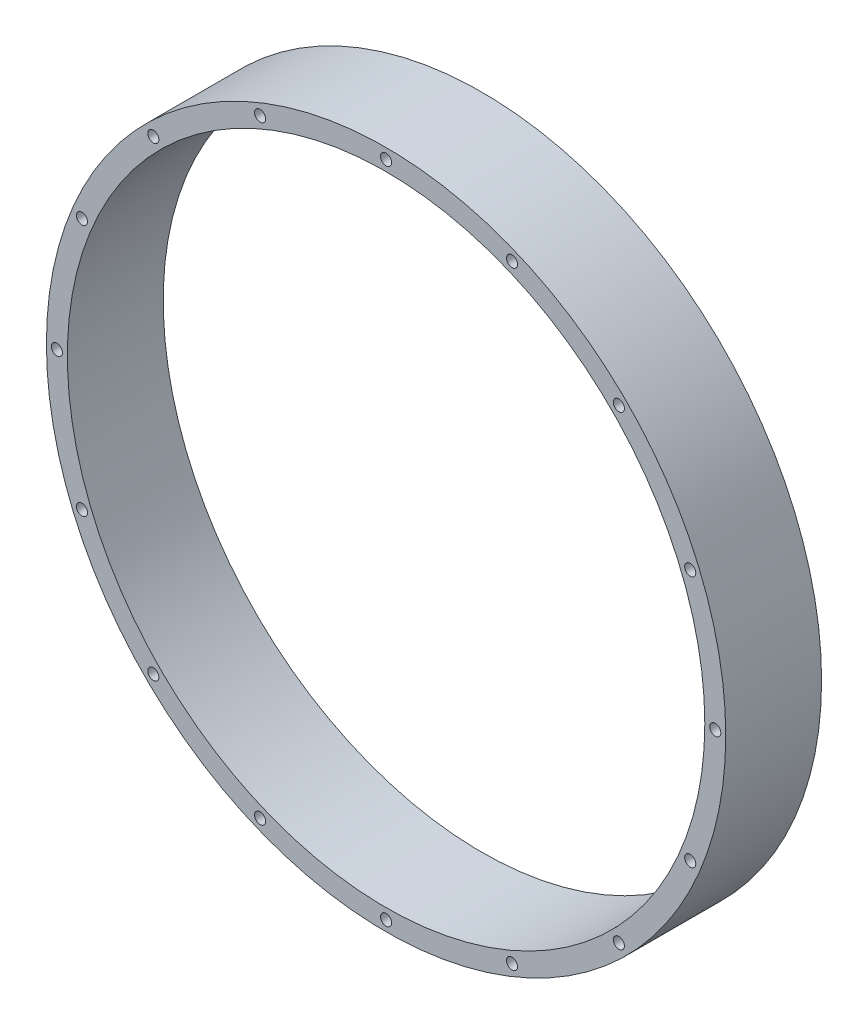
ISO-10303-21;
HEADER;
FILE_DESCRIPTION(('STEP AP214'),'2;1');
FILE_NAME('part.step','',(''),(''),'','','');
FILE_SCHEMA(('AUTOMOTIVE_DESIGN { 1 0 10303 214 1 1 1 1 }'));
ENDSEC;
DATA;
#1=APPLICATION_CONTEXT('core data for automotive mechanical design processes');
#2=APPLICATION_PROTOCOL_DEFINITION('international standard','automotive_design',2000,#1);
#3=PRODUCT_CONTEXT('',#1,'mechanical');
#4=PRODUCT('Part','Part','',(#3));
#5=PRODUCT_RELATED_PRODUCT_CATEGORY('part','',(#4));
#6=PRODUCT_DEFINITION_FORMATION('','',#4);
#7=PRODUCT_DEFINITION_CONTEXT('part definition',#1,'design');
#8=PRODUCT_DEFINITION('design','',#6,#7);
#9=PRODUCT_DEFINITION_SHAPE('','',#8);
#10=(LENGTH_UNIT() NAMED_UNIT(*) SI_UNIT(.MILLI.,.METRE.));
#11=(NAMED_UNIT(*) PLANE_ANGLE_UNIT() SI_UNIT($,.RADIAN.));
#12=(NAMED_UNIT(*) SI_UNIT($,.STERADIAN.) SOLID_ANGLE_UNIT());
#13=UNCERTAINTY_MEASURE_WITH_UNIT(LENGTH_MEASURE(1.E-05),#10,'distance_accuracy_value','');
#14=(GEOMETRIC_REPRESENTATION_CONTEXT(3) GLOBAL_UNCERTAINTY_ASSIGNED_CONTEXT((#13)) GLOBAL_UNIT_ASSIGNED_CONTEXT((#10,
#11,#12)) REPRESENTATION_CONTEXT('',''));
#15=CARTESIAN_POINT('',(0.,0.,0.));
#16=DIRECTION('',(0.,0.,1.));
#17=DIRECTION('',(1.,0.,0.));
#18=AXIS2_PLACEMENT_3D('',#15,#16,#17);
#19=CARTESIAN_POINT('',(0.,0.,-43.));
#20=DIRECTION('',(0.,0.,1.));
#21=DIRECTION('',(1.,0.,0.));
#22=AXIS2_PLACEMENT_3D('',#19,#20,#21);
#23=CYLINDRICAL_SURFACE('',#22,152.4);
#24=CARTESIAN_POINT('',(0.,0.,-43.));
#25=DIRECTION('',(0.,0.,1.));
#26=DIRECTION('',(1.,0.,0.));
#27=AXIS2_PLACEMENT_3D('',#24,#25,#26);
#28=CIRCLE('',#27,152.4);
#29=CARTESIAN_POINT('',(152.4,0.,-43.));
#30=VERTEX_POINT('',#29);
#31=EDGE_CURVE('E42',#30,#30,#28,.T.);
#32=ORIENTED_EDGE('',*,*,#31,.T.);
#33=EDGE_LOOP('',(#32));
#34=FACE_BOUND('',#33,.T.);
#35=CARTESIAN_POINT('',(0.,0.,0.));
#36=DIRECTION('',(0.,0.,1.));
#37=DIRECTION('',(1.,0.,0.));
#38=AXIS2_PLACEMENT_3D('',#35,#36,#37);
#39=CIRCLE('',#38,152.4);
#40=CARTESIAN_POINT('',(152.4,0.,0.));
#41=VERTEX_POINT('',#40);
#42=EDGE_CURVE('E51',#41,#41,#39,.T.);
#43=ORIENTED_EDGE('',*,*,#42,.F.);
#44=EDGE_LOOP('',(#43));
#45=FACE_BOUND('',#44,.T.);
#46=ADVANCED_FACE('F40',(#34,#45),#23,.T.);
#47=CARTESIAN_POINT('',(0.,0.,-43.));
#48=DIRECTION('',(0.,0.,1.));
#49=DIRECTION('',(1.,0.,0.));
#50=AXIS2_PLACEMENT_3D('',#47,#48,#49);
#51=CYLINDRICAL_SURFACE('',#50,143.);
#52=CARTESIAN_POINT('',(0.,0.,-43.));
#53=DIRECTION('',(0.,0.,1.));
#54=DIRECTION('',(1.,0.,0.));
#55=AXIS2_PLACEMENT_3D('',#52,#53,#54);
#56=CIRCLE('',#55,143.);
#57=CARTESIAN_POINT('',(143.,0.,-43.));
#58=VERTEX_POINT('',#57);
#59=EDGE_CURVE('E10',#58,#58,#56,.T.);
#60=ORIENTED_EDGE('',*,*,#59,.F.);
#61=EDGE_LOOP('',(#60));
#62=FACE_BOUND('',#61,.T.);
#63=CARTESIAN_POINT('',(0.,0.,0.));
#64=DIRECTION('',(0.,0.,1.));
#65=DIRECTION('',(1.,0.,0.));
#66=AXIS2_PLACEMENT_3D('',#63,#64,#65);
#67=CIRCLE('',#66,143.);
#68=CARTESIAN_POINT('',(143.,0.,0.));
#69=VERTEX_POINT('',#68);
#70=EDGE_CURVE('E37',#69,#69,#67,.T.);
#71=ORIENTED_EDGE('',*,*,#70,.T.);
#72=EDGE_LOOP('',(#71));
#73=FACE_BOUND('',#72,.T.);
#74=ADVANCED_FACE('F189',(#62,#73),#51,.F.);
#75=CARTESIAN_POINT('',(0.,0.,-43.));
#76=DIRECTION('',(0.,0.,1.));
#77=DIRECTION('',(1.,0.,0.));
#78=AXIS2_PLACEMENT_3D('',#75,#76,#77);
#79=PLANE('',#78);
#80=CARTESIAN_POINT('',(-104.439671581253,-104.439671581253,-43.));
#81=DIRECTION('',(0.,0.,1.));
#82=DIRECTION('',(0.707106781186546,0.707106781186549,0.));
#83=AXIS2_PLACEMENT_3D('',#80,#81,#82);
#84=CIRCLE('',#83,2.4892);
#85=CARTESIAN_POINT('',(-102.679541381523,-102.679541381524,-43.));
#86=VERTEX_POINT('',#85);
#87=EDGE_CURVE('E70',#86,#86,#84,.T.);
#88=ORIENTED_EDGE('',*,*,#87,.T.);
#89=EDGE_LOOP('',(#88));
#90=FACE_BOUND('',#89,.T.);
#91=CARTESIAN_POINT('',(-56.5223429603234,-136.457006951917,-43.));
#92=DIRECTION('',(0.,0.,1.));
#93=DIRECTION('',(0.382683432365087,0.923879532511288,0.));
#94=AXIS2_PLACEMENT_3D('',#91,#92,#93);
#95=CIRCLE('',#94,2.4892);
#96=CARTESIAN_POINT('',(-55.5697673604802,-134.15728601959,-43.));
#97=VERTEX_POINT('',#96);
#98=EDGE_CURVE('E112',#97,#97,#95,.T.);
#99=ORIENTED_EDGE('',*,*,#98,.T.);
#100=EDGE_LOOP('',(#99));
#101=FACE_BOUND('',#100,.T.);
#102=CARTESIAN_POINT('',(5.15691793747131E-13,-147.7,-43.));
#103=DIRECTION('',(0.,0.,1.));
#104=DIRECTION('',(0.,1.,0.));
#105=AXIS2_PLACEMENT_3D('',#102,#103,#104);
#106=CIRCLE('',#105,2.4892);
#107=CARTESIAN_POINT('',(5.07000798398482E-13,-145.2108,-43.));
#108=VERTEX_POINT('',#107);
#109=EDGE_CURVE('E104',#108,#108,#106,.T.);
#110=ORIENTED_EDGE('',*,*,#109,.T.);
#111=EDGE_LOOP('',(#110));
#112=FACE_BOUND('',#111,.T.);
#113=CARTESIAN_POINT('',(56.5223429603244,-136.457006951917,-43.));
#114=DIRECTION('',(0.,0.,1.));
#115=DIRECTION('',(-0.382683432365094,0.923879532511285,0.));
#116=AXIS2_PLACEMENT_3D('',#113,#114,#115);
#117=CIRCLE('',#116,2.4892);
#118=CARTESIAN_POINT('',(55.5697673604812,-134.15728601959,-43.));
#119=VERTEX_POINT('',#118);
#120=EDGE_CURVE('E97',#119,#119,#117,.T.);
#121=ORIENTED_EDGE('',*,*,#120,.T.);
#122=EDGE_LOOP('',(#121));
#123=FACE_BOUND('',#122,.T.);
#124=CARTESIAN_POINT('',(104.439671581254,-104.439671581253,-43.));
#125=DIRECTION('',(0.,0.,1.));
#126=DIRECTION('',(-0.707106781186551,0.707106781186544,0.));
#127=AXIS2_PLACEMENT_3D('',#124,#125,#126);
#128=CIRCLE('',#127,2.4892);
#129=CARTESIAN_POINT('',(102.679541381524,-102.679541381523,-43.));
#130=VERTEX_POINT('',#129);
#131=EDGE_CURVE('E91',#130,#130,#128,.T.);
#132=ORIENTED_EDGE('',*,*,#131,.T.);
#133=EDGE_LOOP('',(#132));
#134=FACE_BOUND('',#133,.T.);
#135=CARTESIAN_POINT('',(136.457006951917,-56.5223429603229,-43.));
#136=DIRECTION('',(0.,0.,1.));
#137=DIRECTION('',(-0.923879532511289,0.382683432365084,0.));
#138=AXIS2_PLACEMENT_3D('',#135,#136,#137);
#139=CIRCLE('',#138,2.4892);
#140=CARTESIAN_POINT('',(134.15728601959,-55.5697673604798,-43.));
#141=VERTEX_POINT('',#140);
#142=EDGE_CURVE('E87',#141,#141,#139,.T.);
#143=ORIENTED_EDGE('',*,*,#142,.T.);
#144=EDGE_LOOP('',(#143));
#145=FACE_BOUND('',#144,.T.);
#146=CARTESIAN_POINT('',(147.7,0.,-43.));
#147=DIRECTION('',(0.,0.,1.));
#148=DIRECTION('',(-1.,0.,0.));
#149=AXIS2_PLACEMENT_3D('',#146,#147,#148);
#150=CIRCLE('',#149,2.4892);
#151=CARTESIAN_POINT('',(145.2108,0.,-43.));
#152=VERTEX_POINT('',#151);
#153=EDGE_CURVE('E82',#152,#152,#150,.T.);
#154=ORIENTED_EDGE('',*,*,#153,.T.);
#155=EDGE_LOOP('',(#154));
#156=FACE_BOUND('',#155,.T.);
#157=CARTESIAN_POINT('',(136.457006951917,56.5223429603248,-43.));
#158=DIRECTION('',(0.,0.,1.));
#159=DIRECTION('',(-0.923879532511284,-0.382683432365097,0.));
#160=AXIS2_PLACEMENT_3D('',#157,#158,#159);
#161=CIRCLE('',#160,2.4892);
#162=CARTESIAN_POINT('',(134.15728601959,55.5697673604816,-43.));
#163=VERTEX_POINT('',#162);
#164=EDGE_CURVE('E74',#163,#163,#161,.T.);
#165=ORIENTED_EDGE('',*,*,#164,.T.);
#166=EDGE_LOOP('',(#165));
#167=FACE_BOUND('',#166,.T.);
#168=CARTESIAN_POINT('',(104.439671581252,104.439671581254,-43.));
#169=DIRECTION('',(0.,0.,1.));
#170=DIRECTION('',(-0.707106781186541,-0.707106781186554,0.));
#171=AXIS2_PLACEMENT_3D('',#168,#169,#170);
#172=CIRCLE('',#171,2.4892);
#173=CARTESIAN_POINT('',(102.679541381523,102.679541381524,-43.));
#174=VERTEX_POINT('',#173);
#175=EDGE_CURVE('E73',#174,#174,#172,.T.);
#176=ORIENTED_EDGE('',*,*,#175,.T.);
#177=EDGE_LOOP('',(#176));
#178=FACE_BOUND('',#177,.T.);
#179=CARTESIAN_POINT('',(56.5223429603224,136.457006951918,-43.));
#180=DIRECTION('',(0.,0.,1.));
#181=DIRECTION('',(-0.382683432365081,-0.923879532511291,0.));
#182=AXIS2_PLACEMENT_3D('',#179,#180,#181);
#183=CIRCLE('',#182,2.4892);
#184=CARTESIAN_POINT('',(55.5697673604792,134.157286019591,-43.));
#185=VERTEX_POINT('',#184);
#186=EDGE_CURVE('E148',#185,#185,#183,.T.);
#187=ORIENTED_EDGE('',*,*,#186,.T.);
#188=EDGE_LOOP('',(#187));
#189=FACE_BOUND('',#188,.T.);
#190=CARTESIAN_POINT('',(-1.54707538124139E-12,147.7,-43.));
#191=DIRECTION('',(0.,0.,1.));
#192=DIRECTION('',(0.,-1.,0.));
#193=AXIS2_PLACEMENT_3D('',#190,#191,#192);
#194=CIRCLE('',#193,2.4892);
#195=CARTESIAN_POINT('',(-1.52100239519545E-12,145.2108,-43.));
#196=VERTEX_POINT('',#195);
#197=EDGE_CURVE('E138',#196,#196,#194,.T.);
#198=ORIENTED_EDGE('',*,*,#197,.T.);
#199=EDGE_LOOP('',(#198));
#200=FACE_BOUND('',#199,.T.);
#201=CARTESIAN_POINT('',(-56.5223429603252,136.457006951916,-43.));
#202=DIRECTION('',(0.,0.,1.));
#203=DIRECTION('',(0.3826834323651,-0.923879532511283,0.));
#204=AXIS2_PLACEMENT_3D('',#201,#202,#203);
#205=CIRCLE('',#204,2.4892);
#206=CARTESIAN_POINT('',(-55.569767360482,134.157286019589,-43.));
#207=VERTEX_POINT('',#206);
#208=EDGE_CURVE('E131',#207,#207,#205,.T.);
#209=ORIENTED_EDGE('',*,*,#208,.T.);
#210=EDGE_LOOP('',(#209));
#211=FACE_BOUND('',#210,.T.);
#212=CARTESIAN_POINT('',(-104.439671581254,104.439671581252,-43.));
#213=DIRECTION('',(0.,0.,1.));
#214=DIRECTION('',(0.707106781186556,-0.707106781186539,0.));
#215=AXIS2_PLACEMENT_3D('',#212,#213,#214);
#216=CIRCLE('',#215,2.4892);
#217=CARTESIAN_POINT('',(-102.679541381525,102.679541381522,-43.));
#218=VERTEX_POINT('',#217);
#219=EDGE_CURVE('E126',#218,#218,#216,.T.);
#220=ORIENTED_EDGE('',*,*,#219,.T.);
#221=EDGE_LOOP('',(#220));
#222=FACE_BOUND('',#221,.T.);
#223=CARTESIAN_POINT('',(-136.457006951918,56.5223429603219,-43.));
#224=DIRECTION('',(0.,0.,1.));
#225=DIRECTION('',(0.923879532511292,-0.382683432365077,0.));
#226=AXIS2_PLACEMENT_3D('',#223,#224,#225);
#227=CIRCLE('',#226,2.4892);
#228=CARTESIAN_POINT('',(-134.157286019591,55.5697673604788,-43.));
#229=VERTEX_POINT('',#228);
#230=EDGE_CURVE('E124',#229,#229,#227,.T.);
#231=ORIENTED_EDGE('',*,*,#230,.T.);
#232=EDGE_LOOP('',(#231));
#233=FACE_BOUND('',#232,.T.);
#234=CARTESIAN_POINT('',(-136.457006951917,-56.5223429603239,-43.));
#235=DIRECTION('',(0.,0.,1.));
#236=DIRECTION('',(0.923879532511287,0.382683432365091,0.));
#237=AXIS2_PLACEMENT_3D('',#234,#235,#236);
#238=CIRCLE('',#237,2.4892);
#239=CARTESIAN_POINT('',(-134.15728601959,-55.5697673604807,-43.));
#240=VERTEX_POINT('',#239);
#241=EDGE_CURVE('E64',#240,#240,#238,.T.);
#242=ORIENTED_EDGE('',*,*,#241,.T.);
#243=EDGE_LOOP('',(#242));
#244=FACE_BOUND('',#243,.T.);
#245=CARTESIAN_POINT('',(-147.7,0.,-43.));
#246=DIRECTION('',(0.,0.,1.));
#247=DIRECTION('',(1.,0.,0.));
#248=AXIS2_PLACEMENT_3D('',#245,#246,#247);
#249=CIRCLE('',#248,2.4892);
#250=CARTESIAN_POINT('',(-145.2108,0.,-43.));
#251=VERTEX_POINT('',#250);
#252=EDGE_CURVE('E52',#251,#251,#249,.T.);
#253=ORIENTED_EDGE('',*,*,#252,.T.);
#254=EDGE_LOOP('',(#253));
#255=FACE_BOUND('',#254,.T.);
#256=ORIENTED_EDGE('',*,*,#31,.F.);
#257=EDGE_LOOP('',(#256));
#258=FACE_BOUND('',#257,.T.);
#259=ORIENTED_EDGE('',*,*,#59,.T.);
#260=EDGE_LOOP('',(#259));
#261=FACE_BOUND('',#260,.T.);
#262=ADVANCED_FACE('F154',(#90,#101,#112,#123,#134,#145,#156,#167,#178,#189,#200,#211,#222,#233,
#244,#255,#258,#261),#79,.F.);
#263=CARTESIAN_POINT('',(0.,0.,0.));
#264=DIRECTION('',(0.,0.,1.));
#265=DIRECTION('',(1.,0.,0.));
#266=AXIS2_PLACEMENT_3D('',#263,#264,#265);
#267=PLANE('',#266);
#268=CARTESIAN_POINT('',(-104.439671581253,-104.439671581253,0.));
#269=DIRECTION('',(0.,0.,1.));
#270=DIRECTION('',(0.707106781186546,0.707106781186549,0.));
#271=AXIS2_PLACEMENT_3D('',#268,#269,#270);
#272=CIRCLE('',#271,2.4892);
#273=CARTESIAN_POINT('',(-102.679541381523,-102.679541381524,0.));
#274=VERTEX_POINT('',#273);
#275=EDGE_CURVE('E111',#274,#274,#272,.T.);
#276=ORIENTED_EDGE('',*,*,#275,.F.);
#277=EDGE_LOOP('',(#276));
#278=FACE_BOUND('',#277,.T.);
#279=CARTESIAN_POINT('',(-56.5223429603234,-136.457006951917,0.));
#280=DIRECTION('',(0.,0.,1.));
#281=DIRECTION('',(0.382683432365087,0.923879532511288,0.));
#282=AXIS2_PLACEMENT_3D('',#279,#280,#281);
#283=CIRCLE('',#282,2.4892);
#284=CARTESIAN_POINT('',(-55.5697673604802,-134.15728601959,0.));
#285=VERTEX_POINT('',#284);
#286=EDGE_CURVE('E107',#285,#285,#283,.T.);
#287=ORIENTED_EDGE('',*,*,#286,.F.);
#288=EDGE_LOOP('',(#287));
#289=FACE_BOUND('',#288,.T.);
#290=CARTESIAN_POINT('',(5.15691793747131E-13,-147.7,0.));
#291=DIRECTION('',(0.,0.,1.));
#292=DIRECTION('',(0.,1.,0.));
#293=AXIS2_PLACEMENT_3D('',#290,#291,#292);
#294=CIRCLE('',#293,2.4892);
#295=CARTESIAN_POINT('',(5.07000798398482E-13,-145.2108,0.));
#296=VERTEX_POINT('',#295);
#297=EDGE_CURVE('E105',#296,#296,#294,.T.);
#298=ORIENTED_EDGE('',*,*,#297,.F.);
#299=EDGE_LOOP('',(#298));
#300=FACE_BOUND('',#299,.T.);
#301=CARTESIAN_POINT('',(56.5223429603244,-136.457006951917,0.));
#302=DIRECTION('',(0.,0.,1.));
#303=DIRECTION('',(-0.382683432365094,0.923879532511285,0.));
#304=AXIS2_PLACEMENT_3D('',#301,#302,#303);
#305=CIRCLE('',#304,2.4892);
#306=CARTESIAN_POINT('',(55.5697673604812,-134.15728601959,0.));
#307=VERTEX_POINT('',#306);
#308=EDGE_CURVE('E96',#307,#307,#305,.T.);
#309=ORIENTED_EDGE('',*,*,#308,.F.);
#310=EDGE_LOOP('',(#309));
#311=FACE_BOUND('',#310,.T.);
#312=CARTESIAN_POINT('',(104.439671581254,-104.439671581253,0.));
#313=DIRECTION('',(0.,0.,1.));
#314=DIRECTION('',(-0.707106781186551,0.707106781186544,0.));
#315=AXIS2_PLACEMENT_3D('',#312,#313,#314);
#316=CIRCLE('',#315,2.4892);
#317=CARTESIAN_POINT('',(102.679541381524,-102.679541381523,0.));
#318=VERTEX_POINT('',#317);
#319=EDGE_CURVE('E89',#318,#318,#316,.T.);
#320=ORIENTED_EDGE('',*,*,#319,.F.);
#321=EDGE_LOOP('',(#320));
#322=FACE_BOUND('',#321,.T.);
#323=CARTESIAN_POINT('',(136.457006951917,-56.5223429603229,0.));
#324=DIRECTION('',(0.,0.,1.));
#325=DIRECTION('',(-0.923879532511289,0.382683432365084,0.));
#326=AXIS2_PLACEMENT_3D('',#323,#324,#325);
#327=CIRCLE('',#326,2.4892);
#328=CARTESIAN_POINT('',(134.15728601959,-55.5697673604798,0.));
#329=VERTEX_POINT('',#328);
#330=EDGE_CURVE('E81',#329,#329,#327,.T.);
#331=ORIENTED_EDGE('',*,*,#330,.F.);
#332=EDGE_LOOP('',(#331));
#333=FACE_BOUND('',#332,.T.);
#334=CARTESIAN_POINT('',(147.7,0.,0.));
#335=DIRECTION('',(0.,0.,1.));
#336=DIRECTION('',(-1.,0.,0.));
#337=AXIS2_PLACEMENT_3D('',#334,#335,#336);
#338=CIRCLE('',#337,2.4892);
#339=CARTESIAN_POINT('',(145.2108,0.,0.));
#340=VERTEX_POINT('',#339);
#341=EDGE_CURVE('E79',#340,#340,#338,.T.);
#342=ORIENTED_EDGE('',*,*,#341,.F.);
#343=EDGE_LOOP('',(#342));
#344=FACE_BOUND('',#343,.T.);
#345=CARTESIAN_POINT('',(136.457006951917,56.5223429603248,0.));
#346=DIRECTION('',(0.,0.,1.));
#347=DIRECTION('',(-0.923879532511284,-0.382683432365097,0.));
#348=AXIS2_PLACEMENT_3D('',#345,#346,#347);
#349=CIRCLE('',#348,2.4892);
#350=CARTESIAN_POINT('',(134.15728601959,55.5697673604816,0.));
#351=VERTEX_POINT('',#350);
#352=EDGE_CURVE('E72',#351,#351,#349,.T.);
#353=ORIENTED_EDGE('',*,*,#352,.F.);
#354=EDGE_LOOP('',(#353));
#355=FACE_BOUND('',#354,.T.);
#356=CARTESIAN_POINT('',(104.439671581252,104.439671581254,0.));
#357=DIRECTION('',(0.,0.,1.));
#358=DIRECTION('',(-0.707106781186541,-0.707106781186554,0.));
#359=AXIS2_PLACEMENT_3D('',#356,#357,#358);
#360=CIRCLE('',#359,2.4892);
#361=CARTESIAN_POINT('',(102.679541381523,102.679541381524,0.));
#362=VERTEX_POINT('',#361);
#363=EDGE_CURVE('E149',#362,#362,#360,.T.);
#364=ORIENTED_EDGE('',*,*,#363,.F.);
#365=EDGE_LOOP('',(#364));
#366=FACE_BOUND('',#365,.T.);
#367=CARTESIAN_POINT('',(56.5223429603224,136.457006951918,0.));
#368=DIRECTION('',(0.,0.,1.));
#369=DIRECTION('',(-0.382683432365081,-0.923879532511291,0.));
#370=AXIS2_PLACEMENT_3D('',#367,#368,#369);
#371=CIRCLE('',#370,2.4892);
#372=CARTESIAN_POINT('',(55.5697673604792,134.157286019591,0.));
#373=VERTEX_POINT('',#372);
#374=EDGE_CURVE('E141',#373,#373,#371,.T.);
#375=ORIENTED_EDGE('',*,*,#374,.F.);
#376=EDGE_LOOP('',(#375));
#377=FACE_BOUND('',#376,.T.);
#378=CARTESIAN_POINT('',(-1.54707538124139E-12,147.7,0.));
#379=DIRECTION('',(0.,0.,1.));
#380=DIRECTION('',(0.,-1.,0.));
#381=AXIS2_PLACEMENT_3D('',#378,#379,#380);
#382=CIRCLE('',#381,2.4892);
#383=CARTESIAN_POINT('',(-1.52100239519545E-12,145.2108,0.));
#384=VERTEX_POINT('',#383);
#385=EDGE_CURVE('E139',#384,#384,#382,.T.);
#386=ORIENTED_EDGE('',*,*,#385,.F.);
#387=EDGE_LOOP('',(#386));
#388=FACE_BOUND('',#387,.T.);
#389=CARTESIAN_POINT('',(-56.5223429603252,136.457006951916,0.));
#390=DIRECTION('',(0.,0.,1.));
#391=DIRECTION('',(0.3826834323651,-0.923879532511283,0.));
#392=AXIS2_PLACEMENT_3D('',#389,#390,#391);
#393=CIRCLE('',#392,2.4892);
#394=CARTESIAN_POINT('',(-55.569767360482,134.157286019589,0.));
#395=VERTEX_POINT('',#394);
#396=EDGE_CURVE('E132',#395,#395,#393,.T.);
#397=ORIENTED_EDGE('',*,*,#396,.F.);
#398=EDGE_LOOP('',(#397));
#399=FACE_BOUND('',#398,.T.);
#400=CARTESIAN_POINT('',(-104.439671581254,104.439671581252,0.));
#401=DIRECTION('',(0.,0.,1.));
#402=DIRECTION('',(0.707106781186556,-0.707106781186539,0.));
#403=AXIS2_PLACEMENT_3D('',#400,#401,#402);
#404=CIRCLE('',#403,2.4892);
#405=CARTESIAN_POINT('',(-102.679541381525,102.679541381522,0.));
#406=VERTEX_POINT('',#405);
#407=EDGE_CURVE('E123',#406,#406,#404,.T.);
#408=ORIENTED_EDGE('',*,*,#407,.F.);
#409=EDGE_LOOP('',(#408));
#410=FACE_BOUND('',#409,.T.);
#411=CARTESIAN_POINT('',(-136.457006951918,56.5223429603219,0.));
#412=DIRECTION('',(0.,0.,1.));
#413=DIRECTION('',(0.923879532511292,-0.382683432365077,0.));
#414=AXIS2_PLACEMENT_3D('',#411,#412,#413);
#415=CIRCLE('',#414,2.4892);
#416=CARTESIAN_POINT('',(-134.157286019591,55.5697673604788,0.));
#417=VERTEX_POINT('',#416);
#418=EDGE_CURVE('E116',#417,#417,#415,.T.);
#419=ORIENTED_EDGE('',*,*,#418,.F.);
#420=EDGE_LOOP('',(#419));
#421=FACE_BOUND('',#420,.T.);
#422=CARTESIAN_POINT('',(-136.457006951917,-56.5223429603239,0.));
#423=DIRECTION('',(0.,0.,1.));
#424=DIRECTION('',(0.923879532511287,0.382683432365091,0.));
#425=AXIS2_PLACEMENT_3D('',#422,#423,#424);
#426=CIRCLE('',#425,2.4892);
#427=CARTESIAN_POINT('',(-134.15728601959,-55.5697673604807,0.));
#428=VERTEX_POINT('',#427);
#429=EDGE_CURVE('E63',#428,#428,#426,.T.);
#430=ORIENTED_EDGE('',*,*,#429,.F.);
#431=EDGE_LOOP('',(#430));
#432=FACE_BOUND('',#431,.T.);
#433=CARTESIAN_POINT('',(-147.7,0.,0.));
#434=DIRECTION('',(0.,0.,1.));
#435=DIRECTION('',(1.,0.,0.));
#436=AXIS2_PLACEMENT_3D('',#433,#434,#435);
#437=CIRCLE('',#436,2.4892);
#438=CARTESIAN_POINT('',(-145.2108,0.,0.));
#439=VERTEX_POINT('',#438);
#440=EDGE_CURVE('E59',#439,#439,#437,.T.);
#441=ORIENTED_EDGE('',*,*,#440,.F.);
#442=EDGE_LOOP('',(#441));
#443=FACE_BOUND('',#442,.T.);
#444=ORIENTED_EDGE('',*,*,#42,.T.);
#445=EDGE_LOOP('',(#444));
#446=FACE_BOUND('',#445,.T.);
#447=ORIENTED_EDGE('',*,*,#70,.F.);
#448=EDGE_LOOP('',(#447));
#449=FACE_BOUND('',#448,.T.);
#450=ADVANCED_FACE('F167',(#278,#289,#300,#311,#322,#333,#344,#355,#366,#377,#388,#399,#410,
#421,#432,#443,#446,#449),#267,.T.);
#451=CARTESIAN_POINT('',(-147.7,0.,-43.));
#452=DIRECTION('',(0.,0.,1.));
#453=DIRECTION('',(1.,0.,0.));
#454=AXIS2_PLACEMENT_3D('',#451,#452,#453);
#455=CYLINDRICAL_SURFACE('',#454,2.4892);
#456=ORIENTED_EDGE('',*,*,#252,.F.);
#457=EDGE_LOOP('',(#456));
#458=FACE_BOUND('',#457,.T.);
#459=ORIENTED_EDGE('',*,*,#440,.T.);
#460=EDGE_LOOP('',(#459));
#461=FACE_BOUND('',#460,.T.);
#462=ADVANCED_FACE('F166',(#458,#461),#455,.F.);
#463=CARTESIAN_POINT('',(-136.457006951917,-56.5223429603239,-43.));
#464=DIRECTION('',(0.,0.,1.));
#465=DIRECTION('',(1.,0.,0.));
#466=AXIS2_PLACEMENT_3D('',#463,#464,#465);
#467=CYLINDRICAL_SURFACE('',#466,2.4892);
#468=ORIENTED_EDGE('',*,*,#241,.F.);
#469=EDGE_LOOP('',(#468));
#470=FACE_BOUND('',#469,.T.);
#471=ORIENTED_EDGE('',*,*,#429,.T.);
#472=EDGE_LOOP('',(#471));
#473=FACE_BOUND('',#472,.T.);
#474=ADVANCED_FACE('F203',(#470,#473),#467,.F.);
#475=CARTESIAN_POINT('',(-136.457006951918,56.5223429603219,-43.));
#476=DIRECTION('',(0.,0.,1.));
#477=DIRECTION('',(1.,0.,0.));
#478=AXIS2_PLACEMENT_3D('',#475,#476,#477);
#479=CYLINDRICAL_SURFACE('',#478,2.4892);
#480=ORIENTED_EDGE('',*,*,#230,.F.);
#481=EDGE_LOOP('',(#480));
#482=FACE_BOUND('',#481,.T.);
#483=ORIENTED_EDGE('',*,*,#418,.T.);
#484=EDGE_LOOP('',(#483));
#485=FACE_BOUND('',#484,.T.);
#486=ADVANCED_FACE('F202',(#482,#485),#479,.F.);
#487=CARTESIAN_POINT('',(-104.439671581254,104.439671581252,-43.));
#488=DIRECTION('',(0.,0.,1.));
#489=DIRECTION('',(1.,0.,0.));
#490=AXIS2_PLACEMENT_3D('',#487,#488,#489);
#491=CYLINDRICAL_SURFACE('',#490,2.4892);
#492=ORIENTED_EDGE('',*,*,#219,.F.);
#493=EDGE_LOOP('',(#492));
#494=FACE_BOUND('',#493,.T.);
#495=ORIENTED_EDGE('',*,*,#407,.T.);
#496=EDGE_LOOP('',(#495));
#497=FACE_BOUND('',#496,.T.);
#498=ADVANCED_FACE('F238',(#494,#497),#491,.F.);
#499=CARTESIAN_POINT('',(-56.5223429603252,136.457006951916,-43.));
#500=DIRECTION('',(0.,0.,1.));
#501=DIRECTION('',(1.,0.,0.));
#502=AXIS2_PLACEMENT_3D('',#499,#500,#501);
#503=CYLINDRICAL_SURFACE('',#502,2.4892);
#504=ORIENTED_EDGE('',*,*,#208,.F.);
#505=EDGE_LOOP('',(#504));
#506=FACE_BOUND('',#505,.T.);
#507=ORIENTED_EDGE('',*,*,#396,.T.);
#508=EDGE_LOOP('',(#507));
#509=FACE_BOUND('',#508,.T.);
#510=ADVANCED_FACE('F241',(#506,#509),#503,.F.);
#511=CARTESIAN_POINT('',(-1.54707538124139E-12,147.7,-43.));
#512=DIRECTION('',(0.,0.,1.));
#513=DIRECTION('',(1.,0.,0.));
#514=AXIS2_PLACEMENT_3D('',#511,#512,#513);
#515=CYLINDRICAL_SURFACE('',#514,2.4892);
#516=ORIENTED_EDGE('',*,*,#197,.F.);
#517=EDGE_LOOP('',(#516));
#518=FACE_BOUND('',#517,.T.);
#519=ORIENTED_EDGE('',*,*,#385,.T.);
#520=EDGE_LOOP('',(#519));
#521=FACE_BOUND('',#520,.T.);
#522=ADVANCED_FACE('F250',(#518,#521),#515,.F.);
#523=CARTESIAN_POINT('',(56.5223429603224,136.457006951918,-43.));
#524=DIRECTION('',(0.,0.,1.));
#525=DIRECTION('',(1.,0.,0.));
#526=AXIS2_PLACEMENT_3D('',#523,#524,#525);
#527=CYLINDRICAL_SURFACE('',#526,2.4892);
#528=ORIENTED_EDGE('',*,*,#186,.F.);
#529=EDGE_LOOP('',(#528));
#530=FACE_BOUND('',#529,.T.);
#531=ORIENTED_EDGE('',*,*,#374,.T.);
#532=EDGE_LOOP('',(#531));
#533=FACE_BOUND('',#532,.T.);
#534=ADVANCED_FACE('F165',(#530,#533),#527,.F.);
#535=CARTESIAN_POINT('',(104.439671581252,104.439671581254,-43.));
#536=DIRECTION('',(0.,0.,1.));
#537=DIRECTION('',(1.,0.,0.));
#538=AXIS2_PLACEMENT_3D('',#535,#536,#537);
#539=CYLINDRICAL_SURFACE('',#538,2.4892);
#540=ORIENTED_EDGE('',*,*,#175,.F.);
#541=EDGE_LOOP('',(#540));
#542=FACE_BOUND('',#541,.T.);
#543=ORIENTED_EDGE('',*,*,#363,.T.);
#544=EDGE_LOOP('',(#543));
#545=FACE_BOUND('',#544,.T.);
#546=ADVANCED_FACE('F158',(#542,#545),#539,.F.);
#547=CARTESIAN_POINT('',(136.457006951917,56.5223429603248,-43.));
#548=DIRECTION('',(0.,0.,1.));
#549=DIRECTION('',(1.,0.,0.));
#550=AXIS2_PLACEMENT_3D('',#547,#548,#549);
#551=CYLINDRICAL_SURFACE('',#550,2.4892);
#552=ORIENTED_EDGE('',*,*,#164,.F.);
#553=EDGE_LOOP('',(#552));
#554=FACE_BOUND('',#553,.T.);
#555=ORIENTED_EDGE('',*,*,#352,.T.);
#556=EDGE_LOOP('',(#555));
#557=FACE_BOUND('',#556,.T.);
#558=ADVANCED_FACE('F161',(#554,#557),#551,.F.);
#559=CARTESIAN_POINT('',(147.7,0.,-43.));
#560=DIRECTION('',(0.,0.,1.));
#561=DIRECTION('',(1.,0.,0.));
#562=AXIS2_PLACEMENT_3D('',#559,#560,#561);
#563=CYLINDRICAL_SURFACE('',#562,2.4892);
#564=ORIENTED_EDGE('',*,*,#153,.F.);
#565=EDGE_LOOP('',(#564));
#566=FACE_BOUND('',#565,.T.);
#567=ORIENTED_EDGE('',*,*,#341,.T.);
#568=EDGE_LOOP('',(#567));
#569=FACE_BOUND('',#568,.T.);
#570=ADVANCED_FACE('F207',(#566,#569),#563,.F.);
#571=CARTESIAN_POINT('',(136.457006951917,-56.5223429603229,-43.));
#572=DIRECTION('',(0.,0.,1.));
#573=DIRECTION('',(1.,0.,0.));
#574=AXIS2_PLACEMENT_3D('',#571,#572,#573);
#575=CYLINDRICAL_SURFACE('',#574,2.4892);
#576=ORIENTED_EDGE('',*,*,#142,.F.);
#577=EDGE_LOOP('',(#576));
#578=FACE_BOUND('',#577,.T.);
#579=ORIENTED_EDGE('',*,*,#330,.T.);
#580=EDGE_LOOP('',(#579));
#581=FACE_BOUND('',#580,.T.);
#582=ADVANCED_FACE('F213',(#578,#581),#575,.F.);
#583=CARTESIAN_POINT('',(104.439671581254,-104.439671581253,-43.));
#584=DIRECTION('',(0.,0.,1.));
#585=DIRECTION('',(1.,0.,0.));
#586=AXIS2_PLACEMENT_3D('',#583,#584,#585);
#587=CYLINDRICAL_SURFACE('',#586,2.4892);
#588=ORIENTED_EDGE('',*,*,#131,.F.);
#589=EDGE_LOOP('',(#588));
#590=FACE_BOUND('',#589,.T.);
#591=ORIENTED_EDGE('',*,*,#319,.T.);
#592=EDGE_LOOP('',(#591));
#593=FACE_BOUND('',#592,.T.);
#594=ADVANCED_FACE('F220',(#590,#593),#587,.F.);
#595=CARTESIAN_POINT('',(56.5223429603244,-136.457006951917,-43.));
#596=DIRECTION('',(0.,0.,1.));
#597=DIRECTION('',(1.,0.,0.));
#598=AXIS2_PLACEMENT_3D('',#595,#596,#597);
#599=CYLINDRICAL_SURFACE('',#598,2.4892);
#600=ORIENTED_EDGE('',*,*,#120,.F.);
#601=EDGE_LOOP('',(#600));
#602=FACE_BOUND('',#601,.T.);
#603=ORIENTED_EDGE('',*,*,#308,.T.);
#604=EDGE_LOOP('',(#603));
#605=FACE_BOUND('',#604,.T.);
#606=ADVANCED_FACE('F222',(#602,#605),#599,.F.);
#607=CARTESIAN_POINT('',(5.15691793747131E-13,-147.7,-43.));
#608=DIRECTION('',(0.,0.,1.));
#609=DIRECTION('',(1.,0.,0.));
#610=AXIS2_PLACEMENT_3D('',#607,#608,#609);
#611=CYLINDRICAL_SURFACE('',#610,2.4892);
#612=ORIENTED_EDGE('',*,*,#109,.F.);
#613=EDGE_LOOP('',(#612));
#614=FACE_BOUND('',#613,.T.);
#615=ORIENTED_EDGE('',*,*,#297,.T.);
#616=EDGE_LOOP('',(#615));
#617=FACE_BOUND('',#616,.T.);
#618=ADVANCED_FACE('F223',(#614,#617),#611,.F.);
#619=CARTESIAN_POINT('',(-56.5223429603234,-136.457006951917,-43.));
#620=DIRECTION('',(0.,0.,1.));
#621=DIRECTION('',(1.,0.,0.));
#622=AXIS2_PLACEMENT_3D('',#619,#620,#621);
#623=CYLINDRICAL_SURFACE('',#622,2.4892);
#624=ORIENTED_EDGE('',*,*,#98,.F.);
#625=EDGE_LOOP('',(#624));
#626=FACE_BOUND('',#625,.T.);
#627=ORIENTED_EDGE('',*,*,#286,.T.);
#628=EDGE_LOOP('',(#627));
#629=FACE_BOUND('',#628,.T.);
#630=ADVANCED_FACE('F226',(#626,#629),#623,.F.);
#631=CARTESIAN_POINT('',(-104.439671581253,-104.439671581253,-43.));
#632=DIRECTION('',(0.,0.,1.));
#633=DIRECTION('',(1.,0.,0.));
#634=AXIS2_PLACEMENT_3D('',#631,#632,#633);
#635=CYLINDRICAL_SURFACE('',#634,2.4892);
#636=ORIENTED_EDGE('',*,*,#87,.F.);
#637=EDGE_LOOP('',(#636));
#638=FACE_BOUND('',#637,.T.);
#639=ORIENTED_EDGE('',*,*,#275,.T.);
#640=EDGE_LOOP('',(#639));
#641=FACE_BOUND('',#640,.T.);
#642=ADVANCED_FACE('F235',(#638,#641),#635,.F.);
#643=CLOSED_SHELL('',(#46,#74,#262,#450,#462,#474,#486,#498,#510,#522,#534,#546,#558,#570,#582,
#594,#606,#618,#630,#642));
#644=MANIFOLD_SOLID_BREP('B2',#643);
#645=ADVANCED_BREP_SHAPE_REPRESENTATION('',(#18,#644),#14);
#646=SHAPE_DEFINITION_REPRESENTATION(#9,#645);
ENDSEC;
END-ISO-10303-21;
